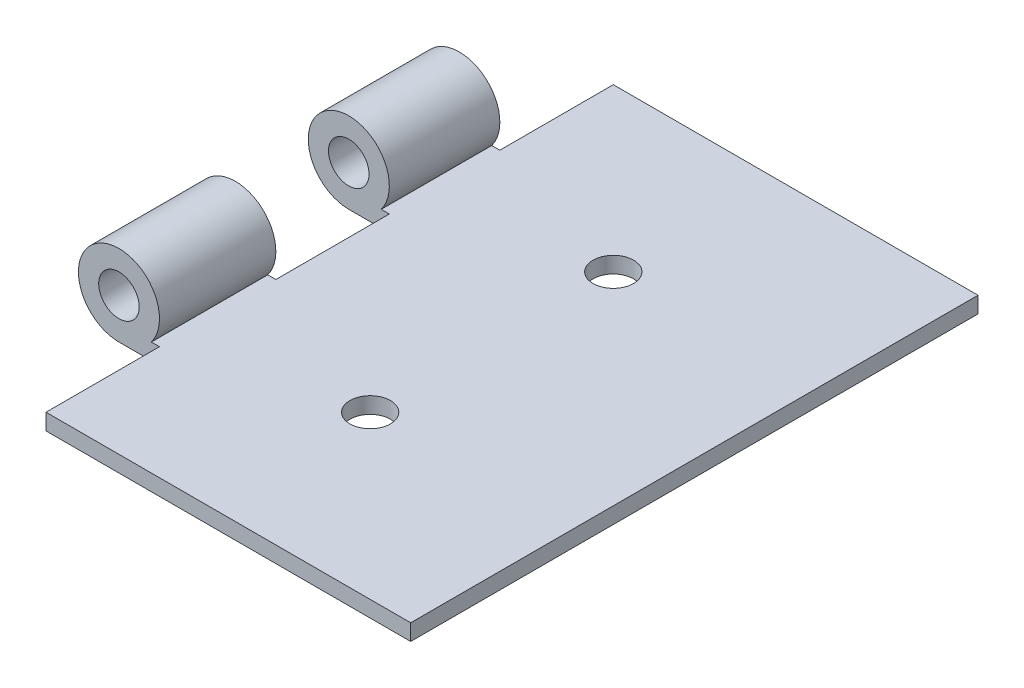
ISO-10303-21;
HEADER;
FILE_DESCRIPTION(('STEP AP214'),'2;1');
FILE_NAME('part.step','',(''),(''),'','','');
FILE_SCHEMA(('AUTOMOTIVE_DESIGN { 1 0 10303 214 1 1 1 1 }'));
ENDSEC;
DATA;
#1=APPLICATION_CONTEXT('core data for automotive mechanical design processes');
#2=APPLICATION_PROTOCOL_DEFINITION('international standard','automotive_design',2000,#1);
#3=PRODUCT_CONTEXT('',#1,'mechanical');
#4=PRODUCT('Part','Part','',(#3));
#5=PRODUCT_RELATED_PRODUCT_CATEGORY('part','',(#4));
#6=PRODUCT_DEFINITION_FORMATION('','',#4);
#7=PRODUCT_DEFINITION_CONTEXT('part definition',#1,'design');
#8=PRODUCT_DEFINITION('design','',#6,#7);
#9=PRODUCT_DEFINITION_SHAPE('','',#8);
#10=(LENGTH_UNIT() NAMED_UNIT(*) SI_UNIT(.MILLI.,.METRE.));
#11=(NAMED_UNIT(*) PLANE_ANGLE_UNIT() SI_UNIT($,.RADIAN.));
#12=(NAMED_UNIT(*) SI_UNIT($,.STERADIAN.) SOLID_ANGLE_UNIT());
#13=UNCERTAINTY_MEASURE_WITH_UNIT(LENGTH_MEASURE(1.E-05),#10,'distance_accuracy_value','');
#14=(GEOMETRIC_REPRESENTATION_CONTEXT(3) GLOBAL_UNCERTAINTY_ASSIGNED_CONTEXT((#13)) GLOBAL_UNIT_ASSIGNED_CONTEXT((#10,
#11,#12)) REPRESENTATION_CONTEXT('',''));
#15=CARTESIAN_POINT('',(0.,0.,0.));
#16=DIRECTION('',(0.,0.,1.));
#17=DIRECTION('',(1.,0.,0.));
#18=AXIS2_PLACEMENT_3D('',#15,#16,#17);
#19=CARTESIAN_POINT('',(-25.,5.,-49.142135623731));
#20=DIRECTION('',(0.,0.,1.));
#21=DIRECTION('',(1.,0.,0.));
#22=AXIS2_PLACEMENT_3D('',#19,#20,#21);
#23=CYLINDRICAL_SURFACE('',#22,5.);
#24=CARTESIAN_POINT('',(-25.,5.,6.63960944051068));
#25=DIRECTION('',(0.,0.,1.));
#26=DIRECTION('',(1.,0.,0.));
#27=AXIS2_PLACEMENT_3D('',#24,#25,#26);
#28=CIRCLE('',#27,5.);
#29=CARTESIAN_POINT('',(-25.,0.,6.63960944051068));
#30=VERTEX_POINT('',#29);
#31=CARTESIAN_POINT('',(-21.,2.,6.63960944051068));
#32=VERTEX_POINT('',#31);
#33=EDGE_CURVE('E183',#30,#32,#28,.F.);
#34=ORIENTED_EDGE('',*,*,#33,.F.);
#35=DIRECTION('',(0.,0.,1.));
#36=VECTOR('',#35,1.);
#37=CARTESIAN_POINT('',(-25.,0.,-35.));
#38=LINE('',#37,#36);
#39=CARTESIAN_POINT('',(-25.,0.,21.));
#40=VERTEX_POINT('',#39);
#41=EDGE_CURVE('E227',#30,#40,#38,.T.);
#42=ORIENTED_EDGE('',*,*,#41,.T.);
#43=CARTESIAN_POINT('',(-25.,5.,21.));
#44=DIRECTION('',(0.,0.,-1.));
#45=DIRECTION('',(-1.,0.,0.));
#46=AXIS2_PLACEMENT_3D('',#43,#44,#45);
#47=CIRCLE('',#46,5.);
#48=CARTESIAN_POINT('',(-21.,2.,21.));
#49=VERTEX_POINT('',#48);
#50=EDGE_CURVE('E178',#49,#40,#47,.F.);
#51=ORIENTED_EDGE('',*,*,#50,.F.);
#52=DIRECTION('',(0.,0.,1.));
#53=VECTOR('',#52,1.);
#54=CARTESIAN_POINT('',(-21.,2.,-49.142135623731));
#55=LINE('',#54,#53);
#56=EDGE_CURVE('E215',#49,#32,#55,.F.);
#57=ORIENTED_EDGE('',*,*,#56,.T.);
#58=EDGE_LOOP('',(#34,#42,#51,#57));
#59=FACE_BOUND('',#58,.T.);
#60=ADVANCED_FACE('F33',(#59),#23,.T.);
#61=CARTESIAN_POINT('',(25.,2.,-35.));
#62=DIRECTION('',(-1.,0.,0.));
#63=DIRECTION('',(0.,0.,1.));
#64=AXIS2_PLACEMENT_3D('',#61,#62,#63);
#65=PLANE('',#64);
#66=DIRECTION('',(0.,0.,-1.));
#67=VECTOR('',#66,1.);
#68=CARTESIAN_POINT('',(25.,0.,-35.));
#69=LINE('',#68,#67);
#70=CARTESIAN_POINT('',(25.,0.,35.));
#71=VERTEX_POINT('',#70);
#72=CARTESIAN_POINT('',(25.,0.,-35.));
#73=VERTEX_POINT('',#72);
#74=EDGE_CURVE('E223',#71,#73,#69,.T.);
#75=ORIENTED_EDGE('',*,*,#74,.T.);
#76=DIRECTION('',(0.,-1.,0.));
#77=VECTOR('',#76,1.);
#78=CARTESIAN_POINT('',(25.,2.,-35.));
#79=LINE('',#78,#77);
#80=CARTESIAN_POINT('',(25.,2.,-35.));
#81=VERTEX_POINT('',#80);
#82=EDGE_CURVE('E11',#81,#73,#79,.T.);
#83=ORIENTED_EDGE('',*,*,#82,.F.);
#84=DIRECTION('',(0.,0.,-1.));
#85=VECTOR('',#84,1.);
#86=CARTESIAN_POINT('',(25.,2.,-35.));
#87=LINE('',#86,#85);
#88=CARTESIAN_POINT('',(25.,2.,35.));
#89=VERTEX_POINT('',#88);
#90=EDGE_CURVE('E216',#89,#81,#87,.T.);
#91=ORIENTED_EDGE('',*,*,#90,.F.);
#92=DIRECTION('',(0.,-1.,0.));
#93=VECTOR('',#92,1.);
#94=CARTESIAN_POINT('',(25.,2.,35.));
#95=LINE('',#94,#93);
#96=EDGE_CURVE('E43',#89,#71,#95,.T.);
#97=ORIENTED_EDGE('',*,*,#96,.T.);
#98=EDGE_LOOP('',(#75,#83,#91,#97));
#99=FACE_BOUND('',#98,.T.);
#100=ADVANCED_FACE('F35',(#99),#65,.F.);
#101=CARTESIAN_POINT('',(-25.,2.,-35.));
#102=DIRECTION('',(0.,0.,1.));
#103=DIRECTION('',(1.,0.,0.));
#104=AXIS2_PLACEMENT_3D('',#101,#102,#103);
#105=PLANE('',#104);
#106=DIRECTION('',(-1.,0.,0.));
#107=VECTOR('',#106,1.);
#108=CARTESIAN_POINT('',(-25.,0.,-35.));
#109=LINE('',#108,#107);
#110=CARTESIAN_POINT('',(-20.,0.,-35.));
#111=VERTEX_POINT('',#110);
#112=EDGE_CURVE('E64',#73,#111,#109,.T.);
#113=ORIENTED_EDGE('',*,*,#112,.T.);
#114=DIRECTION('',(0.,1.,0.));
#115=VECTOR('',#114,1.);
#116=CARTESIAN_POINT('',(-20.,0.,-35.));
#117=LINE('',#116,#115);
#118=CARTESIAN_POINT('',(-20.,2.,-35.));
#119=VERTEX_POINT('',#118);
#120=EDGE_CURVE('E140',#111,#119,#117,.T.);
#121=ORIENTED_EDGE('',*,*,#120,.T.);
#122=DIRECTION('',(-1.,0.,0.));
#123=VECTOR('',#122,1.);
#124=CARTESIAN_POINT('',(-25.,2.,-35.));
#125=LINE('',#124,#123);
#126=EDGE_CURVE('E218',#81,#119,#125,.T.);
#127=ORIENTED_EDGE('',*,*,#126,.F.);
#128=ORIENTED_EDGE('',*,*,#82,.T.);
#129=EDGE_LOOP('',(#113,#121,#127,#128));
#130=FACE_BOUND('',#129,.T.);
#131=ADVANCED_FACE('F268',(#130),#105,.F.);
#132=CARTESIAN_POINT('',(-25.,2.,35.));
#133=DIRECTION('',(0.,0.,-1.));
#134=DIRECTION('',(-1.,0.,0.));
#135=AXIS2_PLACEMENT_3D('',#132,#133,#134);
#136=PLANE('',#135);
#137=DIRECTION('',(1.,0.,0.));
#138=VECTOR('',#137,1.);
#139=CARTESIAN_POINT('',(-25.,2.,35.));
#140=LINE('',#139,#138);
#141=CARTESIAN_POINT('',(-20.,2.,35.));
#142=VERTEX_POINT('',#141);
#143=EDGE_CURVE('E52',#142,#89,#140,.T.);
#144=ORIENTED_EDGE('',*,*,#143,.F.);
#145=DIRECTION('',(0.,1.,0.));
#146=VECTOR('',#145,1.);
#147=CARTESIAN_POINT('',(-20.,0.,35.));
#148=LINE('',#147,#146);
#149=CARTESIAN_POINT('',(-20.,0.,35.));
#150=VERTEX_POINT('',#149);
#151=EDGE_CURVE('E174',#150,#142,#148,.T.);
#152=ORIENTED_EDGE('',*,*,#151,.F.);
#153=DIRECTION('',(1.,0.,0.));
#154=VECTOR('',#153,1.);
#155=CARTESIAN_POINT('',(-25.,0.,35.));
#156=LINE('',#155,#154);
#157=EDGE_CURVE('E219',#150,#71,#156,.T.);
#158=ORIENTED_EDGE('',*,*,#157,.T.);
#159=ORIENTED_EDGE('',*,*,#96,.F.);
#160=EDGE_LOOP('',(#144,#152,#158,#159));
#161=FACE_BOUND('',#160,.T.);
#162=ADVANCED_FACE('F296',(#161),#136,.F.);
#163=CARTESIAN_POINT('',(0.,2.,0.));
#164=DIRECTION('',(0.,1.,0.));
#165=DIRECTION('',(0.,0.,1.));
#166=AXIS2_PLACEMENT_3D('',#163,#164,#165);
#167=PLANE('',#166);
#168=DIRECTION('',(0.,0.,-1.));
#169=VECTOR('',#168,1.);
#170=CARTESIAN_POINT('',(-20.,2.,0.));
#171=LINE('',#170,#169);
#172=CARTESIAN_POINT('',(-20.,2.,-21.));
#173=VERTEX_POINT('',#172);
#174=EDGE_CURVE('E72',#173,#119,#171,.T.);
#175=ORIENTED_EDGE('',*,*,#174,.F.);
#176=DIRECTION('',(1.,0.,0.));
#177=VECTOR('',#176,1.);
#178=CARTESIAN_POINT('',(0.,2.,-21.));
#179=LINE('',#178,#177);
#180=CARTESIAN_POINT('',(-21.,2.,-21.));
#181=VERTEX_POINT('',#180);
#182=EDGE_CURVE('E139',#181,#173,#179,.T.);
#183=ORIENTED_EDGE('',*,*,#182,.F.);
#184=CARTESIAN_POINT('',(-21.,2.,-7.36039055948932));
#185=VERTEX_POINT('',#184);
#186=EDGE_CURVE('E204',#185,#181,#55,.F.);
#187=ORIENTED_EDGE('',*,*,#186,.F.);
#188=DIRECTION('',(-1.,0.,0.));
#189=VECTOR('',#188,1.);
#190=CARTESIAN_POINT('',(0.,2.,-7.36039055948932));
#191=LINE('',#190,#189);
#192=CARTESIAN_POINT('',(-20.,2.,-7.36039055948932));
#193=VERTEX_POINT('',#192);
#194=EDGE_CURVE('E190',#193,#185,#191,.T.);
#195=ORIENTED_EDGE('',*,*,#194,.F.);
#196=DIRECTION('',(0.,0.,-1.));
#197=VECTOR('',#196,1.);
#198=CARTESIAN_POINT('',(-20.,2.,0.));
#199=LINE('',#198,#197);
#200=CARTESIAN_POINT('',(-20.,2.,6.63960944051068));
#201=VERTEX_POINT('',#200);
#202=EDGE_CURVE('E197',#201,#193,#199,.T.);
#203=ORIENTED_EDGE('',*,*,#202,.F.);
#204=DIRECTION('',(1.,0.,0.));
#205=VECTOR('',#204,1.);
#206=CARTESIAN_POINT('',(0.,2.,6.63960944051068));
#207=LINE('',#206,#205);
#208=EDGE_CURVE('E185',#32,#201,#207,.T.);
#209=ORIENTED_EDGE('',*,*,#208,.F.);
#210=ORIENTED_EDGE('',*,*,#56,.F.);
#211=DIRECTION('',(-1.,0.,0.));
#212=VECTOR('',#211,1.);
#213=CARTESIAN_POINT('',(0.,2.,21.));
#214=LINE('',#213,#212);
#215=CARTESIAN_POINT('',(-20.,2.,21.));
#216=VERTEX_POINT('',#215);
#217=EDGE_CURVE('E180',#216,#49,#214,.T.);
#218=ORIENTED_EDGE('',*,*,#217,.F.);
#219=DIRECTION('',(0.,0.,-1.));
#220=VECTOR('',#219,1.);
#221=CARTESIAN_POINT('',(-20.,2.,0.));
#222=LINE('',#221,#220);
#223=EDGE_CURVE('E195',#142,#216,#222,.T.);
#224=ORIENTED_EDGE('',*,*,#223,.F.);
#225=ORIENTED_EDGE('',*,*,#143,.T.);
#226=ORIENTED_EDGE('',*,*,#90,.T.);
#227=ORIENTED_EDGE('',*,*,#126,.T.);
#228=EDGE_LOOP('',(#175,#183,#187,#195,#203,#209,#210,#218,#224,#225,#226,#227));
#229=FACE_BOUND('',#228,.T.);
#230=CARTESIAN_POINT('',(0.,2.,-15.));
#231=DIRECTION('',(0.,1.,0.));
#232=DIRECTION('',(0.,0.,1.));
#233=AXIS2_PLACEMENT_3D('',#230,#231,#232);
#234=CIRCLE('',#233,2.5);
#235=CARTESIAN_POINT('',(0.,2.,-12.5));
#236=VERTEX_POINT('',#235);
#237=EDGE_CURVE('E205',#236,#236,#234,.T.);
#238=ORIENTED_EDGE('',*,*,#237,.F.);
#239=EDGE_LOOP('',(#238));
#240=FACE_BOUND('',#239,.T.);
#241=CARTESIAN_POINT('',(0.,2.,15.));
#242=DIRECTION('',(0.,1.,0.));
#243=DIRECTION('',(0.,0.,1.));
#244=AXIS2_PLACEMENT_3D('',#241,#242,#243);
#245=CIRCLE('',#244,2.5);
#246=CARTESIAN_POINT('',(0.,2.,17.5));
#247=VERTEX_POINT('',#246);
#248=EDGE_CURVE('E200',#247,#247,#245,.T.);
#249=ORIENTED_EDGE('',*,*,#248,.F.);
#250=EDGE_LOOP('',(#249));
#251=FACE_BOUND('',#250,.T.);
#252=ADVANCED_FACE('F283',(#229,#240,#251),#167,.T.);
#253=CARTESIAN_POINT('',(0.,0.,0.));
#254=DIRECTION('',(0.,1.,0.));
#255=DIRECTION('',(0.,0.,1.));
#256=AXIS2_PLACEMENT_3D('',#253,#254,#255);
#257=PLANE('',#256);
#258=CARTESIAN_POINT('',(0.,0.,-15.));
#259=DIRECTION('',(0.,1.,0.));
#260=DIRECTION('',(0.,0.,1.));
#261=AXIS2_PLACEMENT_3D('',#258,#259,#260);
#262=CIRCLE('',#261,2.5);
#263=CARTESIAN_POINT('',(0.,0.,-12.5));
#264=VERTEX_POINT('',#263);
#265=EDGE_CURVE('E201',#264,#264,#262,.T.);
#266=ORIENTED_EDGE('',*,*,#265,.T.);
#267=EDGE_LOOP('',(#266));
#268=FACE_BOUND('',#267,.T.);
#269=CARTESIAN_POINT('',(0.,0.,15.));
#270=DIRECTION('',(0.,1.,0.));
#271=DIRECTION('',(0.,0.,1.));
#272=AXIS2_PLACEMENT_3D('',#269,#270,#271);
#273=CIRCLE('',#272,2.5);
#274=CARTESIAN_POINT('',(0.,0.,17.5));
#275=VERTEX_POINT('',#274);
#276=EDGE_CURVE('E208',#275,#275,#273,.T.);
#277=ORIENTED_EDGE('',*,*,#276,.T.);
#278=EDGE_LOOP('',(#277));
#279=FACE_BOUND('',#278,.T.);
#280=DIRECTION('',(1.,0.,0.));
#281=VECTOR('',#280,1.);
#282=CARTESIAN_POINT('',(-30.,0.,-21.));
#283=LINE('',#282,#281);
#284=CARTESIAN_POINT('',(-25.,0.,-21.));
#285=VERTEX_POINT('',#284);
#286=CARTESIAN_POINT('',(-20.,0.,-21.));
#287=VERTEX_POINT('',#286);
#288=EDGE_CURVE('E136',#285,#287,#283,.T.);
#289=ORIENTED_EDGE('',*,*,#288,.T.);
#290=DIRECTION('',(0.,0.,-1.));
#291=VECTOR('',#290,1.);
#292=CARTESIAN_POINT('',(-20.,0.,-35.));
#293=LINE('',#292,#291);
#294=EDGE_CURVE('E141',#287,#111,#293,.T.);
#295=ORIENTED_EDGE('',*,*,#294,.T.);
#296=ORIENTED_EDGE('',*,*,#112,.F.);
#297=ORIENTED_EDGE('',*,*,#74,.F.);
#298=ORIENTED_EDGE('',*,*,#157,.F.);
#299=DIRECTION('',(0.,0.,-1.));
#300=VECTOR('',#299,1.);
#301=CARTESIAN_POINT('',(-20.,0.,35.));
#302=LINE('',#301,#300);
#303=CARTESIAN_POINT('',(-20.,0.,21.));
#304=VERTEX_POINT('',#303);
#305=EDGE_CURVE('E168',#150,#304,#302,.T.);
#306=ORIENTED_EDGE('',*,*,#305,.T.);
#307=DIRECTION('',(-1.,0.,0.));
#308=VECTOR('',#307,1.);
#309=CARTESIAN_POINT('',(-30.,0.,21.));
#310=LINE('',#309,#308);
#311=EDGE_CURVE('E171',#304,#40,#310,.T.);
#312=ORIENTED_EDGE('',*,*,#311,.T.);
#313=ORIENTED_EDGE('',*,*,#41,.F.);
#314=DIRECTION('',(1.,0.,0.));
#315=VECTOR('',#314,1.);
#316=CARTESIAN_POINT('',(-30.,0.,6.63960944051068));
#317=LINE('',#316,#315);
#318=CARTESIAN_POINT('',(-20.,0.,6.63960944051068));
#319=VERTEX_POINT('',#318);
#320=EDGE_CURVE('E157',#30,#319,#317,.T.);
#321=ORIENTED_EDGE('',*,*,#320,.T.);
#322=DIRECTION('',(0.,0.,-1.));
#323=VECTOR('',#322,1.);
#324=CARTESIAN_POINT('',(-20.,0.,-7.36039055948932));
#325=LINE('',#324,#323);
#326=CARTESIAN_POINT('',(-20.,0.,-7.36039055948932));
#327=VERTEX_POINT('',#326);
#328=EDGE_CURVE('E160',#319,#327,#325,.T.);
#329=ORIENTED_EDGE('',*,*,#328,.T.);
#330=DIRECTION('',(-1.,0.,0.));
#331=VECTOR('',#330,1.);
#332=CARTESIAN_POINT('',(-30.,0.,-7.36039055948932));
#333=LINE('',#332,#331);
#334=CARTESIAN_POINT('',(-25.,0.,-7.36039055948932));
#335=VERTEX_POINT('',#334);
#336=EDGE_CURVE('E164',#327,#335,#333,.T.);
#337=ORIENTED_EDGE('',*,*,#336,.T.);
#338=EDGE_CURVE('E148',#285,#335,#38,.T.);
#339=ORIENTED_EDGE('',*,*,#338,.F.);
#340=EDGE_LOOP('',(#289,#295,#296,#297,#298,#306,#312,#313,#321,#329,#337,#339));
#341=FACE_BOUND('',#340,.T.);
#342=ADVANCED_FACE('F145',(#268,#279,#341),#257,.F.);
#343=CARTESIAN_POINT('',(-25.,5.,-21.));
#344=DIRECTION('',(0.,0.,1.));
#345=DIRECTION('',(1.,0.,0.));
#346=AXIS2_PLACEMENT_3D('',#343,#344,#345);
#347=CIRCLE('',#346,5.);
#348=EDGE_CURVE('E192',#285,#181,#347,.F.);
#349=ORIENTED_EDGE('',*,*,#348,.F.);
#350=ORIENTED_EDGE('',*,*,#338,.T.);
#351=CARTESIAN_POINT('',(-25.,5.,-7.36039055948932));
#352=DIRECTION('',(0.,0.,-1.));
#353=DIRECTION('',(-1.,0.,0.));
#354=AXIS2_PLACEMENT_3D('',#351,#352,#353);
#355=CIRCLE('',#354,5.);
#356=EDGE_CURVE('E188',#185,#335,#355,.F.);
#357=ORIENTED_EDGE('',*,*,#356,.F.);
#358=ORIENTED_EDGE('',*,*,#186,.T.);
#359=EDGE_LOOP('',(#349,#350,#357,#358));
#360=FACE_BOUND('',#359,.T.);
#361=ADVANCED_FACE('F262',(#360),#23,.T.);
#362=CARTESIAN_POINT('',(0.,0.,15.));
#363=DIRECTION('',(0.,1.,0.));
#364=DIRECTION('',(0.,0.,1.));
#365=AXIS2_PLACEMENT_3D('',#362,#363,#364);
#366=CYLINDRICAL_SURFACE('',#365,2.5);
#367=ORIENTED_EDGE('',*,*,#276,.F.);
#368=EDGE_LOOP('',(#367));
#369=FACE_BOUND('',#368,.T.);
#370=ORIENTED_EDGE('',*,*,#248,.T.);
#371=EDGE_LOOP('',(#370));
#372=FACE_BOUND('',#371,.T.);
#373=ADVANCED_FACE('F273',(#369,#372),#366,.F.);
#374=CARTESIAN_POINT('',(0.,0.,-15.));
#375=DIRECTION('',(0.,1.,0.));
#376=DIRECTION('',(0.,0.,1.));
#377=AXIS2_PLACEMENT_3D('',#374,#375,#376);
#378=CYLINDRICAL_SURFACE('',#377,2.5);
#379=ORIENTED_EDGE('',*,*,#265,.F.);
#380=EDGE_LOOP('',(#379));
#381=FACE_BOUND('',#380,.T.);
#382=ORIENTED_EDGE('',*,*,#237,.T.);
#383=EDGE_LOOP('',(#382));
#384=FACE_BOUND('',#383,.T.);
#385=ADVANCED_FACE('F280',(#381,#384),#378,.F.);
#386=CARTESIAN_POINT('',(-30.,0.,21.));
#387=DIRECTION('',(0.,0.,-1.));
#388=DIRECTION('',(-1.,0.,0.));
#389=AXIS2_PLACEMENT_3D('',#386,#387,#388);
#390=PLANE('',#389);
#391=ORIENTED_EDGE('',*,*,#217,.T.);
#392=ORIENTED_EDGE('',*,*,#50,.T.);
#393=ORIENTED_EDGE('',*,*,#311,.F.);
#394=DIRECTION('',(0.,1.,0.));
#395=VECTOR('',#394,1.);
#396=CARTESIAN_POINT('',(-20.,0.,21.));
#397=LINE('',#396,#395);
#398=EDGE_CURVE('E161',#304,#216,#397,.T.);
#399=ORIENTED_EDGE('',*,*,#398,.T.);
#400=EDGE_LOOP('',(#391,#392,#393,#399));
#401=FACE_BOUND('',#400,.T.);
#402=CARTESIAN_POINT('',(-25.,5.,21.));
#403=DIRECTION('',(0.,0.,-1.));
#404=DIRECTION('',(-1.,0.,0.));
#405=AXIS2_PLACEMENT_3D('',#402,#403,#404);
#406=CIRCLE('',#405,2.5);
#407=CARTESIAN_POINT('',(-27.5,5.,21.));
#408=VERTEX_POINT('',#407);
#409=EDGE_CURVE('E155',#408,#408,#406,.F.);
#410=ORIENTED_EDGE('',*,*,#409,.F.);
#411=EDGE_LOOP('',(#410));
#412=FACE_BOUND('',#411,.T.);
#413=ADVANCED_FACE('F254',(#401,#412),#390,.F.);
#414=CARTESIAN_POINT('',(-20.,0.,35.));
#415=DIRECTION('',(1.,0.,0.));
#416=DIRECTION('',(0.,0.,-1.));
#417=AXIS2_PLACEMENT_3D('',#414,#415,#416);
#418=PLANE('',#417);
#419=ORIENTED_EDGE('',*,*,#223,.T.);
#420=ORIENTED_EDGE('',*,*,#398,.F.);
#421=ORIENTED_EDGE('',*,*,#305,.F.);
#422=ORIENTED_EDGE('',*,*,#151,.T.);
#423=EDGE_LOOP('',(#419,#420,#421,#422));
#424=FACE_BOUND('',#423,.T.);
#425=ADVANCED_FACE('F244',(#424),#418,.F.);
#426=CARTESIAN_POINT('',(-30.,0.,-7.36039055948932));
#427=DIRECTION('',(0.,0.,-1.));
#428=DIRECTION('',(-1.,0.,0.));
#429=AXIS2_PLACEMENT_3D('',#426,#427,#428);
#430=PLANE('',#429);
#431=ORIENTED_EDGE('',*,*,#194,.T.);
#432=ORIENTED_EDGE('',*,*,#356,.T.);
#433=ORIENTED_EDGE('',*,*,#336,.F.);
#434=DIRECTION('',(0.,1.,0.));
#435=VECTOR('',#434,1.);
#436=CARTESIAN_POINT('',(-20.,0.,-7.36039055948932));
#437=LINE('',#436,#435);
#438=EDGE_CURVE('E149',#327,#193,#437,.T.);
#439=ORIENTED_EDGE('',*,*,#438,.T.);
#440=EDGE_LOOP('',(#431,#432,#433,#439));
#441=FACE_BOUND('',#440,.T.);
#442=CARTESIAN_POINT('',(-25.,5.,-7.36039055948932));
#443=DIRECTION('',(0.,0.,-1.));
#444=DIRECTION('',(-1.,0.,0.));
#445=AXIS2_PLACEMENT_3D('',#442,#443,#444);
#446=CIRCLE('',#445,2.5);
#447=CARTESIAN_POINT('',(-27.5,5.,-7.36039055948932));
#448=VERTEX_POINT('',#447);
#449=EDGE_CURVE('E187',#448,#448,#446,.F.);
#450=ORIENTED_EDGE('',*,*,#449,.F.);
#451=EDGE_LOOP('',(#450));
#452=FACE_BOUND('',#451,.T.);
#453=ADVANCED_FACE('F241',(#441,#452),#430,.F.);
#454=CARTESIAN_POINT('',(-30.,0.,6.63960944051068));
#455=DIRECTION('',(0.,0.,1.));
#456=DIRECTION('',(1.,0.,0.));
#457=AXIS2_PLACEMENT_3D('',#454,#455,#456);
#458=PLANE('',#457);
#459=ORIENTED_EDGE('',*,*,#208,.T.);
#460=DIRECTION('',(0.,1.,0.));
#461=VECTOR('',#460,1.);
#462=CARTESIAN_POINT('',(-20.,0.,6.63960944051068));
#463=LINE('',#462,#461);
#464=EDGE_CURVE('E152',#319,#201,#463,.T.);
#465=ORIENTED_EDGE('',*,*,#464,.F.);
#466=ORIENTED_EDGE('',*,*,#320,.F.);
#467=ORIENTED_EDGE('',*,*,#33,.T.);
#468=EDGE_LOOP('',(#459,#465,#466,#467));
#469=FACE_BOUND('',#468,.T.);
#470=CARTESIAN_POINT('',(-25.,5.,6.63960944051068));
#471=DIRECTION('',(0.,0.,1.));
#472=DIRECTION('',(1.,0.,0.));
#473=AXIS2_PLACEMENT_3D('',#470,#471,#472);
#474=CIRCLE('',#473,2.5);
#475=CARTESIAN_POINT('',(-22.5,5.,6.63960944051068));
#476=VERTEX_POINT('',#475);
#477=EDGE_CURVE('E182',#476,#476,#474,.F.);
#478=ORIENTED_EDGE('',*,*,#477,.F.);
#479=EDGE_LOOP('',(#478));
#480=FACE_BOUND('',#479,.T.);
#481=ADVANCED_FACE('F243',(#469,#480),#458,.F.);
#482=CARTESIAN_POINT('',(-20.,0.,-7.36039055948932));
#483=DIRECTION('',(1.,0.,0.));
#484=DIRECTION('',(0.,0.,-1.));
#485=AXIS2_PLACEMENT_3D('',#482,#483,#484);
#486=PLANE('',#485);
#487=ORIENTED_EDGE('',*,*,#202,.T.);
#488=ORIENTED_EDGE('',*,*,#438,.F.);
#489=ORIENTED_EDGE('',*,*,#328,.F.);
#490=ORIENTED_EDGE('',*,*,#464,.T.);
#491=EDGE_LOOP('',(#487,#488,#489,#490));
#492=FACE_BOUND('',#491,.T.);
#493=ADVANCED_FACE('F251',(#492),#486,.F.);
#494=CARTESIAN_POINT('',(-25.,5.,-49.142135623731));
#495=DIRECTION('',(0.,0.,1.));
#496=DIRECTION('',(1.,0.,0.));
#497=AXIS2_PLACEMENT_3D('',#494,#495,#496);
#498=CYLINDRICAL_SURFACE('',#497,2.5);
#499=CARTESIAN_POINT('',(-25.,5.,-21.));
#500=DIRECTION('',(0.,0.,1.));
#501=DIRECTION('',(1.,0.,0.));
#502=AXIS2_PLACEMENT_3D('',#499,#500,#501);
#503=CIRCLE('',#502,2.5);
#504=CARTESIAN_POINT('',(-22.5,5.,-21.));
#505=VERTEX_POINT('',#504);
#506=EDGE_CURVE('E37',#505,#505,#503,.F.);
#507=ORIENTED_EDGE('',*,*,#506,.T.);
#508=EDGE_LOOP('',(#507));
#509=FACE_BOUND('',#508,.T.);
#510=ORIENTED_EDGE('',*,*,#449,.T.);
#511=EDGE_LOOP('',(#510));
#512=FACE_BOUND('',#511,.T.);
#513=ADVANCED_FACE('F239',(#509,#512),#498,.F.);
#514=CARTESIAN_POINT('',(-30.,0.,-21.));
#515=DIRECTION('',(0.,0.,1.));
#516=DIRECTION('',(1.,0.,0.));
#517=AXIS2_PLACEMENT_3D('',#514,#515,#516);
#518=PLANE('',#517);
#519=ORIENTED_EDGE('',*,*,#182,.T.);
#520=DIRECTION('',(0.,1.,0.));
#521=VECTOR('',#520,1.);
#522=CARTESIAN_POINT('',(-20.,0.,-21.));
#523=LINE('',#522,#521);
#524=EDGE_CURVE('E131',#287,#173,#523,.T.);
#525=ORIENTED_EDGE('',*,*,#524,.F.);
#526=ORIENTED_EDGE('',*,*,#288,.F.);
#527=ORIENTED_EDGE('',*,*,#348,.T.);
#528=EDGE_LOOP('',(#519,#525,#526,#527));
#529=FACE_BOUND('',#528,.T.);
#530=ORIENTED_EDGE('',*,*,#506,.F.);
#531=EDGE_LOOP('',(#530));
#532=FACE_BOUND('',#531,.T.);
#533=ADVANCED_FACE('F133',(#529,#532),#518,.F.);
#534=CARTESIAN_POINT('',(-20.,0.,-35.));
#535=DIRECTION('',(1.,0.,0.));
#536=DIRECTION('',(0.,0.,-1.));
#537=AXIS2_PLACEMENT_3D('',#534,#535,#536);
#538=PLANE('',#537);
#539=ORIENTED_EDGE('',*,*,#174,.T.);
#540=ORIENTED_EDGE('',*,*,#120,.F.);
#541=ORIENTED_EDGE('',*,*,#294,.F.);
#542=ORIENTED_EDGE('',*,*,#524,.T.);
#543=EDGE_LOOP('',(#539,#540,#541,#542));
#544=FACE_BOUND('',#543,.T.);
#545=ADVANCED_FACE('F143',(#544),#538,.F.);
#546=ORIENTED_EDGE('',*,*,#477,.T.);
#547=EDGE_LOOP('',(#546));
#548=FACE_BOUND('',#547,.T.);
#549=ORIENTED_EDGE('',*,*,#409,.T.);
#550=EDGE_LOOP('',(#549));
#551=FACE_BOUND('',#550,.T.);
#552=ADVANCED_FACE('F318',(#548,#551),#498,.F.);
#553=CLOSED_SHELL('',(#60,#100,#131,#162,#252,#342,#361,#373,#385,#413,#425,#453,#481,#493,#513,
#533,#545,#552));
#554=MANIFOLD_SOLID_BREP('B2',#553);
#555=ADVANCED_BREP_SHAPE_REPRESENTATION('',(#18,#554),#14);
#556=SHAPE_DEFINITION_REPRESENTATION(#9,#555);
ENDSEC;
END-ISO-10303-21;
